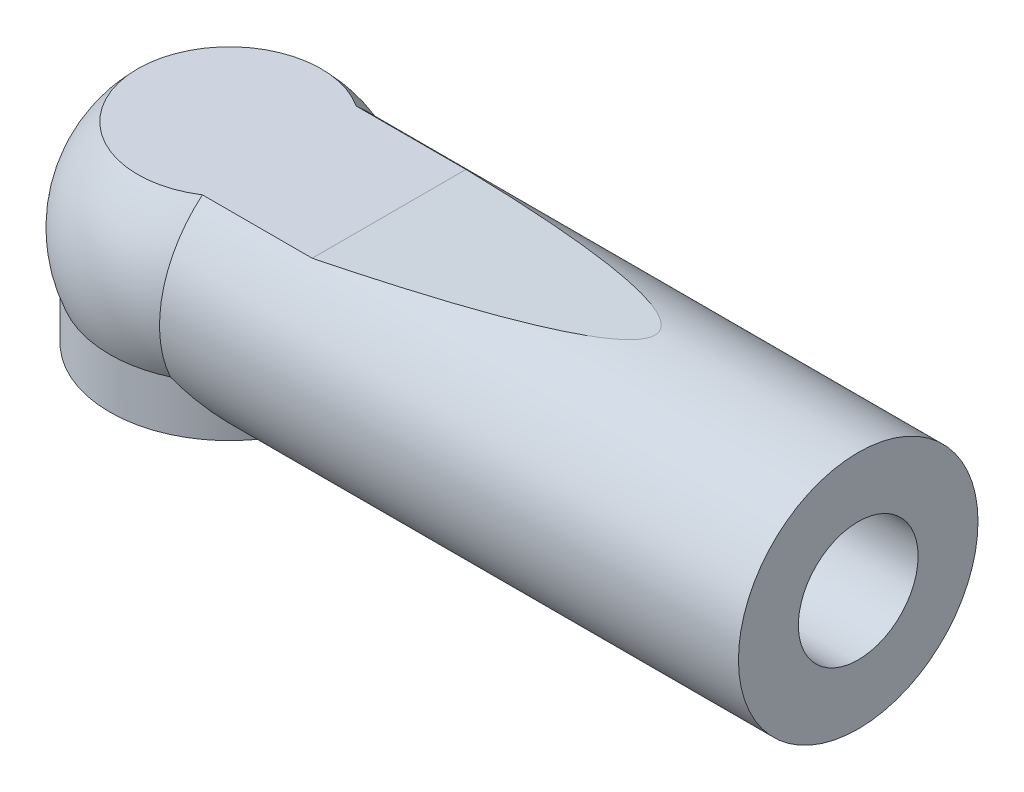
ISO-10303-21;
HEADER;
FILE_DESCRIPTION(('STEP AP214'),'2;1');
FILE_NAME('part.step','',(''),(''),'','','');
FILE_SCHEMA(('AUTOMOTIVE_DESIGN { 1 0 10303 214 1 1 1 1 }'));
ENDSEC;
DATA;
#1=APPLICATION_CONTEXT('core data for automotive mechanical design processes');
#2=APPLICATION_PROTOCOL_DEFINITION('international standard','automotive_design',2000,#1);
#3=PRODUCT_CONTEXT('',#1,'mechanical');
#4=PRODUCT('Part','Part','',(#3));
#5=PRODUCT_RELATED_PRODUCT_CATEGORY('part','',(#4));
#6=PRODUCT_DEFINITION_FORMATION('','',#4);
#7=PRODUCT_DEFINITION_CONTEXT('part definition',#1,'design');
#8=PRODUCT_DEFINITION('design','',#6,#7);
#9=PRODUCT_DEFINITION_SHAPE('','',#8);
#10=(LENGTH_UNIT() NAMED_UNIT(*) SI_UNIT(.MILLI.,.METRE.));
#11=(NAMED_UNIT(*) PLANE_ANGLE_UNIT() SI_UNIT($,.RADIAN.));
#12=(NAMED_UNIT(*) SI_UNIT($,.STERADIAN.) SOLID_ANGLE_UNIT());
#13=UNCERTAINTY_MEASURE_WITH_UNIT(LENGTH_MEASURE(1.E-05),#10,'distance_accuracy_value','');
#14=(GEOMETRIC_REPRESENTATION_CONTEXT(3) GLOBAL_UNCERTAINTY_ASSIGNED_CONTEXT((#13)) GLOBAL_UNIT_ASSIGNED_CONTEXT((#10,
#11,#12)) REPRESENTATION_CONTEXT('',''));
#15=CARTESIAN_POINT('',(0.,0.,0.));
#16=DIRECTION('',(0.,0.,1.));
#17=DIRECTION('',(1.,0.,0.));
#18=AXIS2_PLACEMENT_3D('',#15,#16,#17);
#19=CARTESIAN_POINT('',(15.75,0.,0.));
#20=DIRECTION('',(-1.,0.,0.));
#21=DIRECTION('',(0.,0.,1.));
#22=AXIS2_PLACEMENT_3D('',#19,#20,#21);
#23=CYLINDRICAL_SURFACE('',#22,3.);
#24=CARTESIAN_POINT('',(1.25,0.,0.));
#25=DIRECTION('',(-1.,0.,0.));
#26=DIRECTION('',(0.,0.,1.));
#27=AXIS2_PLACEMENT_3D('',#24,#25,#26);
#28=CIRCLE('',#27,3.);
#29=CARTESIAN_POINT('',(1.25,-1.25,2.72717802865893));
#30=VERTEX_POINT('',#29);
#31=CARTESIAN_POINT('',(1.25,2.3,1.92613602842582));
#32=VERTEX_POINT('',#31);
#33=EDGE_CURVE('E92',#30,#32,#28,.T.);
#34=ORIENTED_EDGE('',*,*,#33,.F.);
#35=CARTESIAN_POINT('',(0.,0.,0.));
#36=DIRECTION('',(-0.707106781186547,-0.707106781186547,0.));
#37=DIRECTION('',(-0.707106781186547,0.707106781186547,0.));
#38=AXIS2_PLACEMENT_3D('',#35,#36,#37);
#39=ELLIPSE('',#38,4.24264068711929,3.);
#40=CARTESIAN_POINT('',(2.3,-2.3,1.92613602842582));
#41=VERTEX_POINT('',#40);
#42=EDGE_CURVE('E80',#30,#41,#39,.F.);
#43=ORIENTED_EDGE('',*,*,#42,.T.);
#44=DIRECTION('',(-1.,0.,0.));
#45=VECTOR('',#44,1.);
#46=CARTESIAN_POINT('',(15.75,-2.3,1.92613602842582));
#47=LINE('',#46,#45);
#48=CARTESIAN_POINT('',(4.,-2.3,1.92613602842582));
#49=VERTEX_POINT('',#48);
#50=EDGE_CURVE('E89',#41,#49,#47,.F.);
#51=ORIENTED_EDGE('',*,*,#50,.T.);
#52=CARTESIAN_POINT('',(-4.5837168574084,0.,0.));
#53=DIRECTION('',(0.258819045102521,0.965925826289068,0.));
#54=DIRECTION('',(-0.965925826289068,0.258819045102521,0.));
#55=AXIS2_PLACEMENT_3D('',#52,#53,#54);
#56=ELLIPSE('',#55,11.5911099154688,3.);
#57=CARTESIAN_POINT('',(4.,-2.3,-1.92613602842582));
#58=VERTEX_POINT('',#57);
#59=EDGE_CURVE('E40',#49,#58,#56,.T.);
#60=ORIENTED_EDGE('',*,*,#59,.T.);
#61=DIRECTION('',(-1.,0.,0.));
#62=VECTOR('',#61,1.);
#63=CARTESIAN_POINT('',(15.75,-2.3,-1.92613602842582));
#64=LINE('',#63,#62);
#65=CARTESIAN_POINT('',(2.3,-2.3,-1.92613602842582));
#66=VERTEX_POINT('',#65);
#67=EDGE_CURVE('E99',#58,#66,#64,.T.);
#68=ORIENTED_EDGE('',*,*,#67,.T.);
#69=CARTESIAN_POINT('',(1.25,-1.25,-2.72717802865893));
#70=VERTEX_POINT('',#69);
#71=EDGE_CURVE('E47',#66,#70,#39,.F.);
#72=ORIENTED_EDGE('',*,*,#71,.T.);
#73=CARTESIAN_POINT('',(1.25,2.3,-1.92613602842582));
#74=VERTEX_POINT('',#73);
#75=EDGE_CURVE('E120',#74,#70,#28,.T.);
#76=ORIENTED_EDGE('',*,*,#75,.F.);
#77=DIRECTION('',(-1.,0.,0.));
#78=VECTOR('',#77,1.);
#79=CARTESIAN_POINT('',(15.75,2.3,-1.92613602842582));
#80=LINE('',#79,#78);
#81=CARTESIAN_POINT('',(4.,2.3,-1.92613602842582));
#82=VERTEX_POINT('',#81);
#83=EDGE_CURVE('E54',#74,#82,#80,.F.);
#84=ORIENTED_EDGE('',*,*,#83,.T.);
#85=CARTESIAN_POINT('',(-17.8830382447118,0.,0.));
#86=DIRECTION('',(0.104528463267654,-0.994521895368273,0.));
#87=DIRECTION('',(-0.994521895368273,-0.104528463267654,0.));
#88=AXIS2_PLACEMENT_3D('',#85,#86,#87);
#89=ELLIPSE('',#88,28.7003167005167,3.);
#90=CARTESIAN_POINT('',(4.,2.3,1.92613602842582));
#91=VERTEX_POINT('',#90);
#92=EDGE_CURVE('E125',#82,#91,#89,.T.);
#93=ORIENTED_EDGE('',*,*,#92,.T.);
#94=DIRECTION('',(-1.,0.,0.));
#95=VECTOR('',#94,1.);
#96=CARTESIAN_POINT('',(15.75,2.3,1.92613602842582));
#97=LINE('',#96,#95);
#98=EDGE_CURVE('E109',#91,#32,#97,.T.);
#99=ORIENTED_EDGE('',*,*,#98,.T.);
#100=EDGE_LOOP('',(#34,#43,#51,#60,#68,#72,#76,#84,#93,#99));
#101=FACE_BOUND('',#100,.T.);
#102=CARTESIAN_POINT('',(15.75,0.,0.));
#103=DIRECTION('',(1.,0.,0.));
#104=DIRECTION('',(0.,0.,-1.));
#105=AXIS2_PLACEMENT_3D('',#102,#103,#104);
#106=CIRCLE('',#105,3.);
#107=CARTESIAN_POINT('',(15.75,0.,-3.));
#108=VERTEX_POINT('',#107);
#109=EDGE_CURVE('E115',#108,#108,#106,.T.);
#110=ORIENTED_EDGE('',*,*,#109,.F.);
#111=EDGE_LOOP('',(#110));
#112=FACE_BOUND('',#111,.T.);
#113=ADVANCED_FACE('F32',(#101,#112),#23,.T.);
#114=CARTESIAN_POINT('',(15.75,0.,0.));
#115=DIRECTION('',(1.,0.,0.));
#116=DIRECTION('',(0.,0.,-1.));
#117=AXIS2_PLACEMENT_3D('',#114,#115,#116);
#118=PLANE('',#117);
#119=CARTESIAN_POINT('',(15.75,0.,0.));
#120=DIRECTION('',(1.,0.,0.));
#121=DIRECTION('',(0.,0.,-1.));
#122=AXIS2_PLACEMENT_3D('',#119,#120,#121);
#123=CIRCLE('',#122,1.5);
#124=CARTESIAN_POINT('',(15.75,0.,-1.5));
#125=VERTEX_POINT('',#124);
#126=EDGE_CURVE('E111',#125,#125,#123,.T.);
#127=ORIENTED_EDGE('',*,*,#126,.F.);
#128=EDGE_LOOP('',(#127));
#129=FACE_BOUND('',#128,.T.);
#130=ORIENTED_EDGE('',*,*,#109,.T.);
#131=EDGE_LOOP('',(#130));
#132=FACE_BOUND('',#131,.T.);
#133=ADVANCED_FACE('F141',(#129,#132),#118,.T.);
#134=CARTESIAN_POINT('',(0.,0.,0.));
#135=DIRECTION('',(0.,1.,0.));
#136=DIRECTION('',(1.,0.,0.));
#137=AXIS2_PLACEMENT_3D('',#134,#135,#136);
#138=SPHERICAL_SURFACE('',#137,3.25);
#139=CARTESIAN_POINT('',(0.,-1.25,0.));
#140=DIRECTION('',(0.,1.,0.));
#141=DIRECTION('',(0.,0.,1.));
#142=AXIS2_PLACEMENT_3D('',#139,#140,#141);
#143=CIRCLE('',#142,3.);
#144=EDGE_CURVE('E93',#30,#70,#143,.F.);
#145=ORIENTED_EDGE('',*,*,#144,.F.);
#146=ORIENTED_EDGE('',*,*,#33,.T.);
#147=CARTESIAN_POINT('',(0.,2.3,0.));
#148=DIRECTION('',(0.,-1.,0.));
#149=DIRECTION('',(0.,0.,-1.));
#150=AXIS2_PLACEMENT_3D('',#147,#148,#149);
#151=CIRCLE('',#150,2.29619250064101);
#152=EDGE_CURVE('E123',#74,#32,#151,.F.);
#153=ORIENTED_EDGE('',*,*,#152,.F.);
#154=ORIENTED_EDGE('',*,*,#75,.T.);
#155=EDGE_LOOP('',(#145,#146,#153,#154));
#156=FACE_BOUND('',#155,.T.);
#157=ADVANCED_FACE('F34',(#156),#138,.T.);
#158=CARTESIAN_POINT('',(3.75,0.,0.));
#159=DIRECTION('',(1.,0.,0.));
#160=DIRECTION('',(0.,0.,-1.));
#161=AXIS2_PLACEMENT_3D('',#158,#159,#160);
#162=CYLINDRICAL_SURFACE('',#161,1.5);
#163=CARTESIAN_POINT('',(3.75,0.,0.));
#164=DIRECTION('',(1.,0.,0.));
#165=DIRECTION('',(0.,0.,-1.));
#166=AXIS2_PLACEMENT_3D('',#163,#164,#165);
#167=CIRCLE('',#166,1.5);
#168=CARTESIAN_POINT('',(3.75,0.,-1.5));
#169=VERTEX_POINT('',#168);
#170=EDGE_CURVE('E112',#169,#169,#167,.T.);
#171=ORIENTED_EDGE('',*,*,#170,.F.);
#172=EDGE_LOOP('',(#171));
#173=FACE_BOUND('',#172,.T.);
#174=ORIENTED_EDGE('',*,*,#126,.T.);
#175=EDGE_LOOP('',(#174));
#176=FACE_BOUND('',#175,.T.);
#177=ADVANCED_FACE('F148',(#173,#176),#162,.F.);
#178=CARTESIAN_POINT('',(3.75,0.,0.));
#179=DIRECTION('',(1.,0.,0.));
#180=DIRECTION('',(0.,0.,-1.));
#181=AXIS2_PLACEMENT_3D('',#178,#179,#180);
#182=PLANE('',#181);
#183=ORIENTED_EDGE('',*,*,#170,.T.);
#184=EDGE_LOOP('',(#183));
#185=FACE_BOUND('',#184,.T.);
#186=ADVANCED_FACE('F151',(#185),#182,.T.);
#187=CARTESIAN_POINT('',(4.,2.3,-6.));
#188=DIRECTION('',(0.104528463267654,-0.994521895368273,0.));
#189=DIRECTION('',(0.994521895368273,0.104528463267654,0.));
#190=AXIS2_PLACEMENT_3D('',#187,#188,#189);
#191=PLANE('',#190);
#192=DIRECTION('',(0.,0.,1.));
#193=VECTOR('',#192,1.);
#194=CARTESIAN_POINT('',(4.,2.3,-6.));
#195=LINE('',#194,#193);
#196=EDGE_CURVE('E101',#82,#91,#195,.T.);
#197=ORIENTED_EDGE('',*,*,#196,.T.);
#198=ORIENTED_EDGE('',*,*,#92,.F.);
#199=EDGE_LOOP('',(#197,#198));
#200=FACE_BOUND('',#199,.T.);
#201=ADVANCED_FACE('F137',(#200),#191,.F.);
#202=CARTESIAN_POINT('',(-2.29619250064101,2.3,-6.));
#203=DIRECTION('',(0.,-1.,0.));
#204=DIRECTION('',(0.,0.,-1.));
#205=AXIS2_PLACEMENT_3D('',#202,#203,#204);
#206=PLANE('',#205);
#207=ORIENTED_EDGE('',*,*,#196,.F.);
#208=ORIENTED_EDGE('',*,*,#83,.F.);
#209=ORIENTED_EDGE('',*,*,#152,.T.);
#210=ORIENTED_EDGE('',*,*,#98,.F.);
#211=EDGE_LOOP('',(#207,#208,#209,#210));
#212=FACE_BOUND('',#211,.T.);
#213=ADVANCED_FACE('F130',(#212),#206,.F.);
#214=CARTESIAN_POINT('',(4.,-2.3,-6.));
#215=DIRECTION('',(0.258819045102521,0.965925826289068,0.));
#216=DIRECTION('',(-0.965925826289068,0.258819045102521,0.));
#217=AXIS2_PLACEMENT_3D('',#214,#215,#216);
#218=PLANE('',#217);
#219=DIRECTION('',(0.,0.,1.));
#220=VECTOR('',#219,1.);
#221=CARTESIAN_POINT('',(4.,-2.3,-6.));
#222=LINE('',#221,#220);
#223=EDGE_CURVE('E98',#58,#49,#222,.T.);
#224=ORIENTED_EDGE('',*,*,#223,.F.);
#225=ORIENTED_EDGE('',*,*,#59,.F.);
#226=EDGE_LOOP('',(#224,#225));
#227=FACE_BOUND('',#226,.T.);
#228=ADVANCED_FACE('F128',(#227),#218,.F.);
#229=CARTESIAN_POINT('',(-2.29619250064101,-2.3,-6.));
#230=DIRECTION('',(0.,1.,0.));
#231=DIRECTION('',(-1.,0.,0.));
#232=AXIS2_PLACEMENT_3D('',#229,#230,#231);
#233=PLANE('',#232);
#234=ORIENTED_EDGE('',*,*,#50,.F.);
#235=CARTESIAN_POINT('',(0.,-2.3,0.));
#236=DIRECTION('',(0.,1.,0.));
#237=DIRECTION('',(-1.,0.,0.));
#238=AXIS2_PLACEMENT_3D('',#235,#236,#237);
#239=CIRCLE('',#238,3.);
#240=EDGE_CURVE('E11',#41,#66,#239,.T.);
#241=ORIENTED_EDGE('',*,*,#240,.T.);
#242=ORIENTED_EDGE('',*,*,#67,.F.);
#243=ORIENTED_EDGE('',*,*,#223,.T.);
#244=EDGE_LOOP('',(#234,#241,#242,#243));
#245=FACE_BOUND('',#244,.T.);
#246=ADVANCED_FACE('F96',(#245),#233,.F.);
#247=CARTESIAN_POINT('',(0.,-2.5,0.));
#248=DIRECTION('',(0.,1.,0.));
#249=DIRECTION('',(0.,0.,1.));
#250=AXIS2_PLACEMENT_3D('',#247,#248,#249);
#251=CYLINDRICAL_SURFACE('',#250,3.);
#252=ORIENTED_EDGE('',*,*,#42,.F.);
#253=ORIENTED_EDGE('',*,*,#144,.T.);
#254=ORIENTED_EDGE('',*,*,#71,.F.);
#255=ORIENTED_EDGE('',*,*,#240,.F.);
#256=EDGE_LOOP('',(#252,#253,#254,#255));
#257=FACE_BOUND('',#256,.T.);
#258=CARTESIAN_POINT('',(0.,-2.5,0.));
#259=DIRECTION('',(0.,1.,0.));
#260=DIRECTION('',(0.,0.,1.));
#261=AXIS2_PLACEMENT_3D('',#258,#259,#260);
#262=CIRCLE('',#261,3.);
#263=CARTESIAN_POINT('',(0.,-2.5,3.));
#264=VERTEX_POINT('',#263);
#265=EDGE_CURVE('E162',#264,#264,#262,.T.);
#266=ORIENTED_EDGE('',*,*,#265,.T.);
#267=EDGE_LOOP('',(#266));
#268=FACE_BOUND('',#267,.T.);
#269=ADVANCED_FACE('F78',(#257,#268),#251,.T.);
#270=CARTESIAN_POINT('',(0.,-2.5,0.));
#271=DIRECTION('',(0.,1.,0.));
#272=DIRECTION('',(0.,0.,1.));
#273=AXIS2_PLACEMENT_3D('',#270,#271,#272);
#274=PLANE('',#273);
#275=CARTESIAN_POINT('',(0.,-2.5,0.));
#276=DIRECTION('',(0.,-1.,0.));
#277=DIRECTION('',(0.,0.,-1.));
#278=AXIS2_PLACEMENT_3D('',#275,#276,#277);
#279=CIRCLE('',#278,1.75);
#280=CARTESIAN_POINT('',(0.,-2.5,-1.75));
#281=VERTEX_POINT('',#280);
#282=EDGE_CURVE('E165',#281,#281,#279,.T.);
#283=ORIENTED_EDGE('',*,*,#282,.F.);
#284=EDGE_LOOP('',(#283));
#285=FACE_BOUND('',#284,.T.);
#286=ORIENTED_EDGE('',*,*,#265,.F.);
#287=EDGE_LOOP('',(#286));
#288=FACE_BOUND('',#287,.T.);
#289=ADVANCED_FACE('F180',(#285,#288),#274,.F.);
#290=CARTESIAN_POINT('',(0.,0.,0.));
#291=DIRECTION('',(0.,-1.,0.));
#292=DIRECTION('',(1.,0.,0.));
#293=AXIS2_PLACEMENT_3D('',#290,#291,#292);
#294=SPHERICAL_SURFACE('',#293,2.);
#295=CARTESIAN_POINT('',(0.,-0.968245836551854,0.));
#296=DIRECTION('',(0.,-1.,0.));
#297=DIRECTION('',(0.,0.,-1.));
#298=AXIS2_PLACEMENT_3D('',#295,#296,#297);
#299=CIRCLE('',#298,1.75);
#300=CARTESIAN_POINT('',(0.,-0.968245836551854,-1.75));
#301=VERTEX_POINT('',#300);
#302=EDGE_CURVE('E168',#301,#301,#299,.T.);
#303=ORIENTED_EDGE('',*,*,#302,.T.);
#304=EDGE_LOOP('',(#303));
#305=FACE_BOUND('',#304,.T.);
#306=ADVANCED_FACE('F172',(#305),#294,.F.);
#307=CARTESIAN_POINT('',(0.,-2.5,0.));
#308=DIRECTION('',(0.,-1.,0.));
#309=DIRECTION('',(0.,0.,-1.));
#310=AXIS2_PLACEMENT_3D('',#307,#308,#309);
#311=CYLINDRICAL_SURFACE('',#310,1.75);
#312=ORIENTED_EDGE('',*,*,#302,.F.);
#313=EDGE_LOOP('',(#312));
#314=FACE_BOUND('',#313,.T.);
#315=ORIENTED_EDGE('',*,*,#282,.T.);
#316=EDGE_LOOP('',(#315));
#317=FACE_BOUND('',#316,.T.);
#318=ADVANCED_FACE('F174',(#314,#317),#311,.F.);
#319=CLOSED_SHELL('',(#113,#133,#157,#177,#186,#201,#213,#228,#246,#269,#289,#306,#318));
#320=MANIFOLD_SOLID_BREP('B2',#319);
#321=ADVANCED_BREP_SHAPE_REPRESENTATION('',(#18,#320),#14);
#322=SHAPE_DEFINITION_REPRESENTATION(#9,#321);
ENDSEC;
END-ISO-10303-21;
